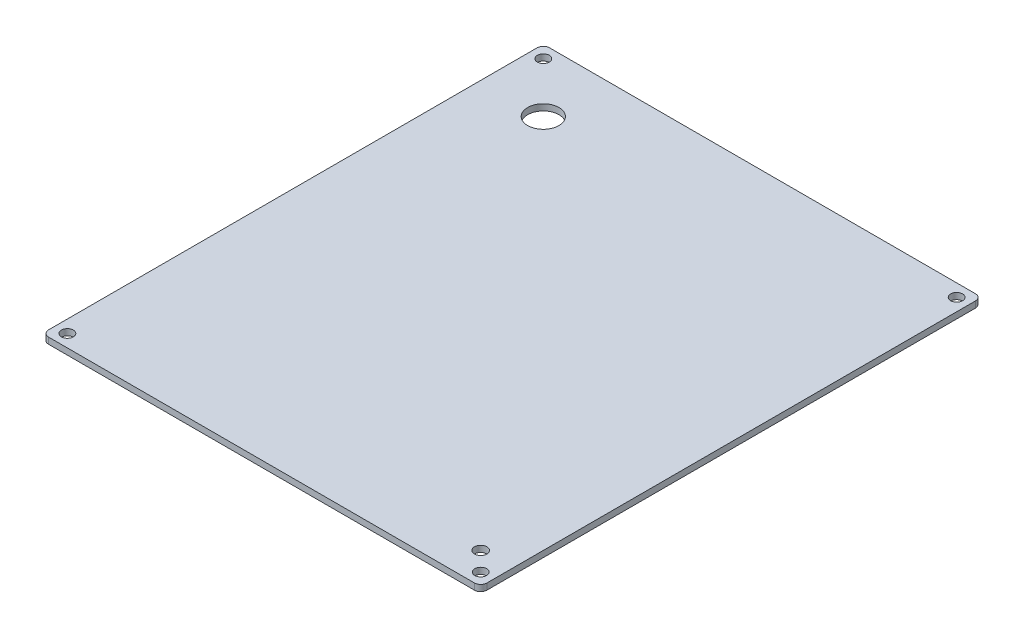
ISO-10303-21;
HEADER;
FILE_DESCRIPTION(('STEP AP214'),'2;1');
FILE_NAME('part.step','',(''),(''),'','','');
FILE_SCHEMA(('AUTOMOTIVE_DESIGN { 1 0 10303 214 1 1 1 1 }'));
ENDSEC;
DATA;
#1=APPLICATION_CONTEXT('core data for automotive mechanical design processes');
#2=APPLICATION_PROTOCOL_DEFINITION('international standard','automotive_design',2000,#1);
#3=PRODUCT_CONTEXT('',#1,'mechanical');
#4=PRODUCT('Part','Part','',(#3));
#5=PRODUCT_RELATED_PRODUCT_CATEGORY('part','',(#4));
#6=PRODUCT_DEFINITION_FORMATION('','',#4);
#7=PRODUCT_DEFINITION_CONTEXT('part definition',#1,'design');
#8=PRODUCT_DEFINITION('design','',#6,#7);
#9=PRODUCT_DEFINITION_SHAPE('','',#8);
#10=(LENGTH_UNIT() NAMED_UNIT(*) SI_UNIT(.MILLI.,.METRE.));
#11=(NAMED_UNIT(*) PLANE_ANGLE_UNIT() SI_UNIT($,.RADIAN.));
#12=(NAMED_UNIT(*) SI_UNIT($,.STERADIAN.) SOLID_ANGLE_UNIT());
#13=UNCERTAINTY_MEASURE_WITH_UNIT(LENGTH_MEASURE(1.E-05),#10,'distance_accuracy_value','');
#14=(GEOMETRIC_REPRESENTATION_CONTEXT(3) GLOBAL_UNCERTAINTY_ASSIGNED_CONTEXT((#13)) GLOBAL_UNIT_ASSIGNED_CONTEXT((#10,
#11,#12)) REPRESENTATION_CONTEXT('',''));
#15=CARTESIAN_POINT('',(0.,0.,0.));
#16=DIRECTION('',(0.,0.,1.));
#17=DIRECTION('',(1.,0.,0.));
#18=AXIS2_PLACEMENT_3D('',#15,#16,#17);
#19=CARTESIAN_POINT('',(0.,2.,0.));
#20=DIRECTION('',(1.,0.,0.));
#21=DIRECTION('',(0.,0.,-1.));
#22=AXIS2_PLACEMENT_3D('',#19,#20,#21);
#23=PLANE('',#22);
#24=DIRECTION('',(0.,0.,1.));
#25=VECTOR('',#24,1.);
#26=CARTESIAN_POINT('',(0.,0.,0.));
#27=LINE('',#26,#25);
#28=CARTESIAN_POINT('',(0.,0.,-158.));
#29=VERTEX_POINT('',#28);
#30=CARTESIAN_POINT('',(0.,0.,-2.));
#31=VERTEX_POINT('',#30);
#32=EDGE_CURVE('E126',#29,#31,#27,.T.);
#33=ORIENTED_EDGE('',*,*,#32,.T.);
#34=DIRECTION('',(0.,-1.,0.));
#35=VECTOR('',#34,1.);
#36=CARTESIAN_POINT('',(0.,2.,-2.));
#37=LINE('',#36,#35);
#38=CARTESIAN_POINT('',(0.,2.,-2.));
#39=VERTEX_POINT('',#38);
#40=EDGE_CURVE('E104',#31,#39,#37,.F.);
#41=ORIENTED_EDGE('',*,*,#40,.T.);
#42=DIRECTION('',(0.,0.,1.));
#43=VECTOR('',#42,1.);
#44=CARTESIAN_POINT('',(0.,2.,0.));
#45=LINE('',#44,#43);
#46=CARTESIAN_POINT('',(0.,2.,-158.));
#47=VERTEX_POINT('',#46);
#48=EDGE_CURVE('E136',#47,#39,#45,.T.);
#49=ORIENTED_EDGE('',*,*,#48,.F.);
#50=DIRECTION('',(0.,-1.,0.));
#51=VECTOR('',#50,1.);
#52=CARTESIAN_POINT('',(0.,2.,-158.));
#53=LINE('',#52,#51);
#54=EDGE_CURVE('E109',#47,#29,#53,.T.);
#55=ORIENTED_EDGE('',*,*,#54,.T.);
#56=EDGE_LOOP('',(#33,#41,#49,#55));
#57=FACE_BOUND('',#56,.T.);
#58=ADVANCED_FACE('F33',(#57),#23,.F.);
#59=CARTESIAN_POINT('',(0.,2.,0.));
#60=DIRECTION('',(0.,0.,-1.));
#61=DIRECTION('',(-1.,0.,0.));
#62=AXIS2_PLACEMENT_3D('',#59,#60,#61);
#63=PLANE('',#62);
#64=DIRECTION('',(1.,0.,0.));
#65=VECTOR('',#64,1.);
#66=CARTESIAN_POINT('',(0.,2.,0.));
#67=LINE('',#66,#65);
#68=CARTESIAN_POINT('',(2.,2.,0.));
#69=VERTEX_POINT('',#68);
#70=CARTESIAN_POINT('',(138.,2.,0.));
#71=VERTEX_POINT('',#70);
#72=EDGE_CURVE('E119',#69,#71,#67,.T.);
#73=ORIENTED_EDGE('',*,*,#72,.F.);
#74=DIRECTION('',(0.,-1.,0.));
#75=VECTOR('',#74,1.);
#76=CARTESIAN_POINT('',(2.,2.,0.));
#77=LINE('',#76,#75);
#78=CARTESIAN_POINT('',(2.,0.,0.));
#79=VERTEX_POINT('',#78);
#80=EDGE_CURVE('E103',#69,#79,#77,.T.);
#81=ORIENTED_EDGE('',*,*,#80,.T.);
#82=DIRECTION('',(1.,0.,0.));
#83=VECTOR('',#82,1.);
#84=CARTESIAN_POINT('',(0.,0.,0.));
#85=LINE('',#84,#83);
#86=CARTESIAN_POINT('',(138.,0.,0.));
#87=VERTEX_POINT('',#86);
#88=EDGE_CURVE('E116',#79,#87,#85,.T.);
#89=ORIENTED_EDGE('',*,*,#88,.T.);
#90=DIRECTION('',(0.,-1.,0.));
#91=VECTOR('',#90,1.);
#92=CARTESIAN_POINT('',(138.,2.,0.));
#93=LINE('',#92,#91);
#94=EDGE_CURVE('E121',#87,#71,#93,.F.);
#95=ORIENTED_EDGE('',*,*,#94,.T.);
#96=EDGE_LOOP('',(#73,#81,#89,#95));
#97=FACE_BOUND('',#96,.T.);
#98=ADVANCED_FACE('F115',(#97),#63,.F.);
#99=CARTESIAN_POINT('',(140.,2.,0.));
#100=DIRECTION('',(-1.,0.,0.));
#101=DIRECTION('',(0.,0.,1.));
#102=AXIS2_PLACEMENT_3D('',#99,#100,#101);
#103=PLANE('',#102);
#104=DIRECTION('',(0.,0.,-1.));
#105=VECTOR('',#104,1.);
#106=CARTESIAN_POINT('',(140.,2.,0.));
#107=LINE('',#106,#105);
#108=CARTESIAN_POINT('',(140.,2.,-2.));
#109=VERTEX_POINT('',#108);
#110=CARTESIAN_POINT('',(140.,2.,-158.));
#111=VERTEX_POINT('',#110);
#112=EDGE_CURVE('E180',#109,#111,#107,.T.);
#113=ORIENTED_EDGE('',*,*,#112,.F.);
#114=DIRECTION('',(0.,-1.,0.));
#115=VECTOR('',#114,1.);
#116=CARTESIAN_POINT('',(140.,2.,-2.));
#117=LINE('',#116,#115);
#118=CARTESIAN_POINT('',(140.,0.,-2.));
#119=VERTEX_POINT('',#118);
#120=EDGE_CURVE('E173',#109,#119,#117,.T.);
#121=ORIENTED_EDGE('',*,*,#120,.T.);
#122=DIRECTION('',(0.,0.,-1.));
#123=VECTOR('',#122,1.);
#124=CARTESIAN_POINT('',(140.,0.,0.));
#125=LINE('',#124,#123);
#126=CARTESIAN_POINT('',(140.,0.,-158.));
#127=VERTEX_POINT('',#126);
#128=EDGE_CURVE('E125',#119,#127,#125,.T.);
#129=ORIENTED_EDGE('',*,*,#128,.T.);
#130=DIRECTION('',(0.,-1.,0.));
#131=VECTOR('',#130,1.);
#132=CARTESIAN_POINT('',(140.,2.,-158.));
#133=LINE('',#132,#131);
#134=EDGE_CURVE('E171',#127,#111,#133,.F.);
#135=ORIENTED_EDGE('',*,*,#134,.T.);
#136=EDGE_LOOP('',(#113,#121,#129,#135));
#137=FACE_BOUND('',#136,.T.);
#138=ADVANCED_FACE('F178',(#137),#103,.F.);
#139=CARTESIAN_POINT('',(0.,2.,-160.));
#140=DIRECTION('',(0.,0.,1.));
#141=DIRECTION('',(1.,0.,0.));
#142=AXIS2_PLACEMENT_3D('',#139,#140,#141);
#143=PLANE('',#142);
#144=DIRECTION('',(-1.,0.,0.));
#145=VECTOR('',#144,1.);
#146=CARTESIAN_POINT('',(0.,2.,-160.));
#147=LINE('',#146,#145);
#148=CARTESIAN_POINT('',(138.,2.,-160.));
#149=VERTEX_POINT('',#148);
#150=CARTESIAN_POINT('',(2.,2.,-160.));
#151=VERTEX_POINT('',#150);
#152=EDGE_CURVE('E155',#149,#151,#147,.T.);
#153=ORIENTED_EDGE('',*,*,#152,.F.);
#154=DIRECTION('',(0.,-1.,0.));
#155=VECTOR('',#154,1.);
#156=CARTESIAN_POINT('',(138.,2.,-160.));
#157=LINE('',#156,#155);
#158=CARTESIAN_POINT('',(138.,0.,-160.));
#159=VERTEX_POINT('',#158);
#160=EDGE_CURVE('E11',#149,#159,#157,.T.);
#161=ORIENTED_EDGE('',*,*,#160,.T.);
#162=DIRECTION('',(-1.,0.,0.));
#163=VECTOR('',#162,1.);
#164=CARTESIAN_POINT('',(0.,0.,-160.));
#165=LINE('',#164,#163);
#166=CARTESIAN_POINT('',(2.,0.,-160.));
#167=VERTEX_POINT('',#166);
#168=EDGE_CURVE('E129',#159,#167,#165,.T.);
#169=ORIENTED_EDGE('',*,*,#168,.T.);
#170=DIRECTION('',(0.,-1.,0.));
#171=VECTOR('',#170,1.);
#172=CARTESIAN_POINT('',(2.,2.,-160.));
#173=LINE('',#172,#171);
#174=EDGE_CURVE('E41',#167,#151,#173,.F.);
#175=ORIENTED_EDGE('',*,*,#174,.T.);
#176=EDGE_LOOP('',(#153,#161,#169,#175));
#177=FACE_BOUND('',#176,.T.);
#178=ADVANCED_FACE('F187',(#177),#143,.F.);
#179=CARTESIAN_POINT('',(0.,2.,0.));
#180=DIRECTION('',(0.,-1.,0.));
#181=DIRECTION('',(0.,0.,-1.));
#182=AXIS2_PLACEMENT_3D('',#179,#180,#181);
#183=PLANE('',#182);
#184=CARTESIAN_POINT('',(136.,2.,-156.));
#185=DIRECTION('',(0.,1.,0.));
#186=DIRECTION('',(0.,0.,-1.));
#187=AXIS2_PLACEMENT_3D('',#184,#185,#186);
#188=CIRCLE('',#187,1.90000000000001);
#189=CARTESIAN_POINT('',(136.,2.,-157.9));
#190=VERTEX_POINT('',#189);
#191=EDGE_CURVE('E196',#190,#190,#188,.T.);
#192=ORIENTED_EDGE('',*,*,#191,.F.);
#193=EDGE_LOOP('',(#192));
#194=FACE_BOUND('',#193,.T.);
#195=CARTESIAN_POINT('',(136.,2.,-4.00000000000003));
#196=DIRECTION('',(0.,1.,0.));
#197=DIRECTION('',(0.,0.,1.));
#198=AXIS2_PLACEMENT_3D('',#195,#196,#197);
#199=CIRCLE('',#198,1.90000000000001);
#200=CARTESIAN_POINT('',(136.,2.,-2.10000000000003));
#201=VERTEX_POINT('',#200);
#202=EDGE_CURVE('E204',#201,#201,#199,.T.);
#203=ORIENTED_EDGE('',*,*,#202,.F.);
#204=EDGE_LOOP('',(#203));
#205=FACE_BOUND('',#204,.T.);
#206=CARTESIAN_POINT('',(4.,2.,-4.00000000000003));
#207=DIRECTION('',(0.,1.,0.));
#208=DIRECTION('',(0.,0.,-1.));
#209=AXIS2_PLACEMENT_3D('',#206,#207,#208);
#210=CIRCLE('',#209,1.9);
#211=CARTESIAN_POINT('',(4.,2.,-5.90000000000003));
#212=VERTEX_POINT('',#211);
#213=EDGE_CURVE('E200',#212,#212,#210,.T.);
#214=ORIENTED_EDGE('',*,*,#213,.F.);
#215=EDGE_LOOP('',(#214));
#216=FACE_BOUND('',#215,.T.);
#217=CARTESIAN_POINT('',(130.,2.,-10.));
#218=DIRECTION('',(0.,1.,0.));
#219=DIRECTION('',(0.,0.,1.));
#220=AXIS2_PLACEMENT_3D('',#217,#218,#219);
#221=CIRCLE('',#220,2.);
#222=CARTESIAN_POINT('',(130.,2.,-8.00000000000001));
#223=VERTEX_POINT('',#222);
#224=EDGE_CURVE('E197',#223,#223,#221,.T.);
#225=ORIENTED_EDGE('',*,*,#224,.F.);
#226=EDGE_LOOP('',(#225));
#227=FACE_BOUND('',#226,.T.);
#228=CARTESIAN_POINT('',(20.,2.,-140.));
#229=DIRECTION('',(0.,1.,0.));
#230=DIRECTION('',(0.,0.,1.));
#231=AXIS2_PLACEMENT_3D('',#228,#229,#230);
#232=CIRCLE('',#231,5.00000000000001);
#233=CARTESIAN_POINT('',(20.,2.,-135.));
#234=VERTEX_POINT('',#233);
#235=EDGE_CURVE('E201',#234,#234,#232,.T.);
#236=ORIENTED_EDGE('',*,*,#235,.F.);
#237=EDGE_LOOP('',(#236));
#238=FACE_BOUND('',#237,.T.);
#239=CARTESIAN_POINT('',(4.,2.,-156.));
#240=DIRECTION('',(0.,1.,0.));
#241=DIRECTION('',(0.,0.,1.));
#242=AXIS2_PLACEMENT_3D('',#239,#240,#241);
#243=CIRCLE('',#242,1.9);
#244=CARTESIAN_POINT('',(4.,2.,-154.1));
#245=VERTEX_POINT('',#244);
#246=EDGE_CURVE('E141',#245,#245,#243,.T.);
#247=ORIENTED_EDGE('',*,*,#246,.F.);
#248=EDGE_LOOP('',(#247));
#249=FACE_BOUND('',#248,.T.);
#250=ORIENTED_EDGE('',*,*,#48,.T.);
#251=CARTESIAN_POINT('',(2.,2.,-2.));
#252=DIRECTION('',(0.,-1.,0.));
#253=DIRECTION('',(0.,0.,-1.));
#254=AXIS2_PLACEMENT_3D('',#251,#252,#253);
#255=CIRCLE('',#254,2.);
#256=EDGE_CURVE('E169',#39,#69,#255,.F.);
#257=ORIENTED_EDGE('',*,*,#256,.T.);
#258=ORIENTED_EDGE('',*,*,#72,.T.);
#259=CARTESIAN_POINT('',(138.,2.,-2.));
#260=DIRECTION('',(0.,-1.,0.));
#261=DIRECTION('',(0.,0.,-1.));
#262=AXIS2_PLACEMENT_3D('',#259,#260,#261);
#263=CIRCLE('',#262,2.);
#264=EDGE_CURVE('E167',#71,#109,#263,.F.);
#265=ORIENTED_EDGE('',*,*,#264,.T.);
#266=ORIENTED_EDGE('',*,*,#112,.T.);
#267=CARTESIAN_POINT('',(138.,2.,-158.));
#268=DIRECTION('',(0.,-1.,0.));
#269=DIRECTION('',(0.,0.,-1.));
#270=AXIS2_PLACEMENT_3D('',#267,#268,#269);
#271=CIRCLE('',#270,2.);
#272=EDGE_CURVE('E54',#111,#149,#271,.F.);
#273=ORIENTED_EDGE('',*,*,#272,.T.);
#274=ORIENTED_EDGE('',*,*,#152,.T.);
#275=CARTESIAN_POINT('',(2.,2.,-158.));
#276=DIRECTION('',(0.,-1.,0.));
#277=DIRECTION('',(0.,0.,-1.));
#278=AXIS2_PLACEMENT_3D('',#275,#276,#277);
#279=CIRCLE('',#278,2.);
#280=EDGE_CURVE('E164',#151,#47,#279,.F.);
#281=ORIENTED_EDGE('',*,*,#280,.T.);
#282=EDGE_LOOP('',(#250,#257,#258,#265,#266,#273,#274,#281));
#283=FACE_BOUND('',#282,.T.);
#284=ADVANCED_FACE('F214',(#194,#205,#216,#227,#238,#249,#283),#183,.F.);
#285=CARTESIAN_POINT('',(0.,0.,0.));
#286=DIRECTION('',(0.,-1.,0.));
#287=DIRECTION('',(0.,0.,-1.));
#288=AXIS2_PLACEMENT_3D('',#285,#286,#287);
#289=PLANE('',#288);
#290=CARTESIAN_POINT('',(136.,0.,-156.));
#291=DIRECTION('',(0.,-1.,0.));
#292=DIRECTION('',(0.,0.,-1.));
#293=AXIS2_PLACEMENT_3D('',#290,#291,#292);
#294=CIRCLE('',#293,1.90000000000001);
#295=CARTESIAN_POINT('',(136.,0.,-157.9));
#296=VERTEX_POINT('',#295);
#297=EDGE_CURVE('E131',#296,#296,#294,.T.);
#298=ORIENTED_EDGE('',*,*,#297,.F.);
#299=EDGE_LOOP('',(#298));
#300=FACE_BOUND('',#299,.T.);
#301=CARTESIAN_POINT('',(136.,0.,-4.00000000000003));
#302=DIRECTION('',(0.,-1.,0.));
#303=DIRECTION('',(0.,0.,-1.));
#304=AXIS2_PLACEMENT_3D('',#301,#302,#303);
#305=CIRCLE('',#304,1.90000000000001);
#306=CARTESIAN_POINT('',(136.,0.,-5.90000000000004));
#307=VERTEX_POINT('',#306);
#308=EDGE_CURVE('E150',#307,#307,#305,.T.);
#309=ORIENTED_EDGE('',*,*,#308,.F.);
#310=EDGE_LOOP('',(#309));
#311=FACE_BOUND('',#310,.T.);
#312=CARTESIAN_POINT('',(4.,0.,-4.00000000000003));
#313=DIRECTION('',(0.,-1.,0.));
#314=DIRECTION('',(0.,0.,-1.));
#315=AXIS2_PLACEMENT_3D('',#312,#313,#314);
#316=CIRCLE('',#315,1.9);
#317=CARTESIAN_POINT('',(4.,0.,-5.90000000000003));
#318=VERTEX_POINT('',#317);
#319=EDGE_CURVE('E147',#318,#318,#316,.T.);
#320=ORIENTED_EDGE('',*,*,#319,.F.);
#321=EDGE_LOOP('',(#320));
#322=FACE_BOUND('',#321,.T.);
#323=CARTESIAN_POINT('',(130.,0.,-10.));
#324=DIRECTION('',(0.,-1.,0.));
#325=DIRECTION('',(0.,0.,-1.));
#326=AXIS2_PLACEMENT_3D('',#323,#324,#325);
#327=CIRCLE('',#326,2.);
#328=CARTESIAN_POINT('',(130.,0.,-12.));
#329=VERTEX_POINT('',#328);
#330=EDGE_CURVE('E144',#329,#329,#327,.T.);
#331=ORIENTED_EDGE('',*,*,#330,.F.);
#332=EDGE_LOOP('',(#331));
#333=FACE_BOUND('',#332,.T.);
#334=CARTESIAN_POINT('',(20.,0.,-140.));
#335=DIRECTION('',(0.,-1.,0.));
#336=DIRECTION('',(0.,0.,-1.));
#337=AXIS2_PLACEMENT_3D('',#334,#335,#336);
#338=CIRCLE('',#337,5.00000000000001);
#339=CARTESIAN_POINT('',(20.,0.,-145.));
#340=VERTEX_POINT('',#339);
#341=EDGE_CURVE('E140',#340,#340,#338,.T.);
#342=ORIENTED_EDGE('',*,*,#341,.F.);
#343=EDGE_LOOP('',(#342));
#344=FACE_BOUND('',#343,.T.);
#345=CARTESIAN_POINT('',(4.,0.,-156.));
#346=DIRECTION('',(0.,-1.,0.));
#347=DIRECTION('',(0.,0.,-1.));
#348=AXIS2_PLACEMENT_3D('',#345,#346,#347);
#349=CIRCLE('',#348,1.9);
#350=CARTESIAN_POINT('',(4.,0.,-157.9));
#351=VERTEX_POINT('',#350);
#352=EDGE_CURVE('E137',#351,#351,#349,.T.);
#353=ORIENTED_EDGE('',*,*,#352,.F.);
#354=EDGE_LOOP('',(#353));
#355=FACE_BOUND('',#354,.T.);
#356=ORIENTED_EDGE('',*,*,#88,.F.);
#357=CARTESIAN_POINT('',(2.,0.,-2.));
#358=DIRECTION('',(0.,-1.,0.));
#359=DIRECTION('',(0.,0.,-1.));
#360=AXIS2_PLACEMENT_3D('',#357,#358,#359);
#361=CIRCLE('',#360,2.);
#362=EDGE_CURVE('E99',#79,#31,#361,.T.);
#363=ORIENTED_EDGE('',*,*,#362,.T.);
#364=ORIENTED_EDGE('',*,*,#32,.F.);
#365=CARTESIAN_POINT('',(2.,0.,-158.));
#366=DIRECTION('',(0.,-1.,0.));
#367=DIRECTION('',(0.,0.,-1.));
#368=AXIS2_PLACEMENT_3D('',#365,#366,#367);
#369=CIRCLE('',#368,2.);
#370=EDGE_CURVE('E120',#29,#167,#369,.T.);
#371=ORIENTED_EDGE('',*,*,#370,.T.);
#372=ORIENTED_EDGE('',*,*,#168,.F.);
#373=CARTESIAN_POINT('',(138.,0.,-158.));
#374=DIRECTION('',(0.,-1.,0.));
#375=DIRECTION('',(0.,0.,-1.));
#376=AXIS2_PLACEMENT_3D('',#373,#374,#375);
#377=CIRCLE('',#376,2.);
#378=EDGE_CURVE('E158',#159,#127,#377,.T.);
#379=ORIENTED_EDGE('',*,*,#378,.T.);
#380=ORIENTED_EDGE('',*,*,#128,.F.);
#381=CARTESIAN_POINT('',(138.,0.,-2.));
#382=DIRECTION('',(0.,-1.,0.));
#383=DIRECTION('',(0.,0.,-1.));
#384=AXIS2_PLACEMENT_3D('',#381,#382,#383);
#385=CIRCLE('',#384,2.);
#386=EDGE_CURVE('E110',#119,#87,#385,.T.);
#387=ORIENTED_EDGE('',*,*,#386,.T.);
#388=EDGE_LOOP('',(#356,#363,#364,#371,#372,#379,#380,#387));
#389=FACE_BOUND('',#388,.T.);
#390=ADVANCED_FACE('F123',(#300,#311,#322,#333,#344,#355,#389),#289,.T.);
#391=CARTESIAN_POINT('',(4.,-8.,-156.));
#392=DIRECTION('',(0.,1.,0.));
#393=DIRECTION('',(0.,0.,1.));
#394=AXIS2_PLACEMENT_3D('',#391,#392,#393);
#395=CYLINDRICAL_SURFACE('',#394,1.9);
#396=ORIENTED_EDGE('',*,*,#352,.T.);
#397=EDGE_LOOP('',(#396));
#398=FACE_BOUND('',#397,.T.);
#399=ORIENTED_EDGE('',*,*,#246,.T.);
#400=EDGE_LOOP('',(#399));
#401=FACE_BOUND('',#400,.T.);
#402=ADVANCED_FACE('F305',(#398,#401),#395,.F.);
#403=CARTESIAN_POINT('',(20.,-8.,-140.));
#404=DIRECTION('',(0.,1.,0.));
#405=DIRECTION('',(0.,0.,1.));
#406=AXIS2_PLACEMENT_3D('',#403,#404,#405);
#407=CYLINDRICAL_SURFACE('',#406,5.00000000000001);
#408=ORIENTED_EDGE('',*,*,#341,.T.);
#409=EDGE_LOOP('',(#408));
#410=FACE_BOUND('',#409,.T.);
#411=ORIENTED_EDGE('',*,*,#235,.T.);
#412=EDGE_LOOP('',(#411));
#413=FACE_BOUND('',#412,.T.);
#414=ADVANCED_FACE('F212',(#410,#413),#407,.F.);
#415=CARTESIAN_POINT('',(130.,-8.,-10.));
#416=DIRECTION('',(0.,1.,0.));
#417=DIRECTION('',(0.,0.,1.));
#418=AXIS2_PLACEMENT_3D('',#415,#416,#417);
#419=CYLINDRICAL_SURFACE('',#418,2.);
#420=ORIENTED_EDGE('',*,*,#330,.T.);
#421=EDGE_LOOP('',(#420));
#422=FACE_BOUND('',#421,.T.);
#423=ORIENTED_EDGE('',*,*,#224,.T.);
#424=EDGE_LOOP('',(#423));
#425=FACE_BOUND('',#424,.T.);
#426=ADVANCED_FACE('F288',(#422,#425),#419,.F.);
#427=CARTESIAN_POINT('',(4.,-8.,-4.00000000000003));
#428=DIRECTION('',(0.,1.,0.));
#429=DIRECTION('',(0.,0.,1.));
#430=AXIS2_PLACEMENT_3D('',#427,#428,#429);
#431=CYLINDRICAL_SURFACE('',#430,1.9);
#432=ORIENTED_EDGE('',*,*,#319,.T.);
#433=EDGE_LOOP('',(#432));
#434=FACE_BOUND('',#433,.T.);
#435=ORIENTED_EDGE('',*,*,#213,.T.);
#436=EDGE_LOOP('',(#435));
#437=FACE_BOUND('',#436,.T.);
#438=ADVANCED_FACE('F279',(#434,#437),#431,.F.);
#439=CARTESIAN_POINT('',(136.,-8.,-4.00000000000003));
#440=DIRECTION('',(0.,1.,0.));
#441=DIRECTION('',(0.,0.,1.));
#442=AXIS2_PLACEMENT_3D('',#439,#440,#441);
#443=CYLINDRICAL_SURFACE('',#442,1.90000000000001);
#444=ORIENTED_EDGE('',*,*,#308,.T.);
#445=EDGE_LOOP('',(#444));
#446=FACE_BOUND('',#445,.T.);
#447=ORIENTED_EDGE('',*,*,#202,.T.);
#448=EDGE_LOOP('',(#447));
#449=FACE_BOUND('',#448,.T.);
#450=ADVANCED_FACE('F270',(#446,#449),#443,.F.);
#451=CARTESIAN_POINT('',(136.,-8.,-156.));
#452=DIRECTION('',(0.,1.,0.));
#453=DIRECTION('',(0.,0.,1.));
#454=AXIS2_PLACEMENT_3D('',#451,#452,#453);
#455=CYLINDRICAL_SURFACE('',#454,1.90000000000001);
#456=ORIENTED_EDGE('',*,*,#297,.T.);
#457=EDGE_LOOP('',(#456));
#458=FACE_BOUND('',#457,.T.);
#459=ORIENTED_EDGE('',*,*,#191,.T.);
#460=EDGE_LOOP('',(#459));
#461=FACE_BOUND('',#460,.T.);
#462=ADVANCED_FACE('F239',(#458,#461),#455,.F.);
#463=CARTESIAN_POINT('',(2.,2.,-2.));
#464=DIRECTION('',(0.,-1.,0.));
#465=DIRECTION('',(0.,0.,-1.));
#466=AXIS2_PLACEMENT_3D('',#463,#464,#465);
#467=CYLINDRICAL_SURFACE('',#466,2.);
#468=ORIENTED_EDGE('',*,*,#256,.F.);
#469=ORIENTED_EDGE('',*,*,#40,.F.);
#470=ORIENTED_EDGE('',*,*,#362,.F.);
#471=ORIENTED_EDGE('',*,*,#80,.F.);
#472=EDGE_LOOP('',(#468,#469,#470,#471));
#473=FACE_BOUND('',#472,.T.);
#474=ADVANCED_FACE('F102',(#473),#467,.T.);
#475=CARTESIAN_POINT('',(138.,2.,-2.));
#476=DIRECTION('',(0.,-1.,0.));
#477=DIRECTION('',(0.,0.,-1.));
#478=AXIS2_PLACEMENT_3D('',#475,#476,#477);
#479=CYLINDRICAL_SURFACE('',#478,2.);
#480=ORIENTED_EDGE('',*,*,#264,.F.);
#481=ORIENTED_EDGE('',*,*,#94,.F.);
#482=ORIENTED_EDGE('',*,*,#386,.F.);
#483=ORIENTED_EDGE('',*,*,#120,.F.);
#484=EDGE_LOOP('',(#480,#481,#482,#483));
#485=FACE_BOUND('',#484,.T.);
#486=ADVANCED_FACE('F228',(#485),#479,.T.);
#487=CARTESIAN_POINT('',(138.,2.,-158.));
#488=DIRECTION('',(0.,-1.,0.));
#489=DIRECTION('',(0.,0.,-1.));
#490=AXIS2_PLACEMENT_3D('',#487,#488,#489);
#491=CYLINDRICAL_SURFACE('',#490,2.);
#492=ORIENTED_EDGE('',*,*,#272,.F.);
#493=ORIENTED_EDGE('',*,*,#134,.F.);
#494=ORIENTED_EDGE('',*,*,#378,.F.);
#495=ORIENTED_EDGE('',*,*,#160,.F.);
#496=EDGE_LOOP('',(#492,#493,#494,#495));
#497=FACE_BOUND('',#496,.T.);
#498=ADVANCED_FACE('F186',(#497),#491,.T.);
#499=CARTESIAN_POINT('',(2.,2.,-158.));
#500=DIRECTION('',(0.,-1.,0.));
#501=DIRECTION('',(0.,0.,-1.));
#502=AXIS2_PLACEMENT_3D('',#499,#500,#501);
#503=CYLINDRICAL_SURFACE('',#502,2.);
#504=ORIENTED_EDGE('',*,*,#280,.F.);
#505=ORIENTED_EDGE('',*,*,#174,.F.);
#506=ORIENTED_EDGE('',*,*,#370,.F.);
#507=ORIENTED_EDGE('',*,*,#54,.F.);
#508=EDGE_LOOP('',(#504,#505,#506,#507));
#509=FACE_BOUND('',#508,.T.);
#510=ADVANCED_FACE('F35',(#509),#503,.T.);
#511=CLOSED_SHELL('',(#58,#98,#138,#178,#284,#390,#402,#414,#426,#438,#450,#462,#474,#486,#498,#510));
#512=MANIFOLD_SOLID_BREP('B2',#511);
#513=ADVANCED_BREP_SHAPE_REPRESENTATION('',(#18,#512),#14);
#514=SHAPE_DEFINITION_REPRESENTATION(#9,#513);
ENDSEC;
END-ISO-10303-21;
